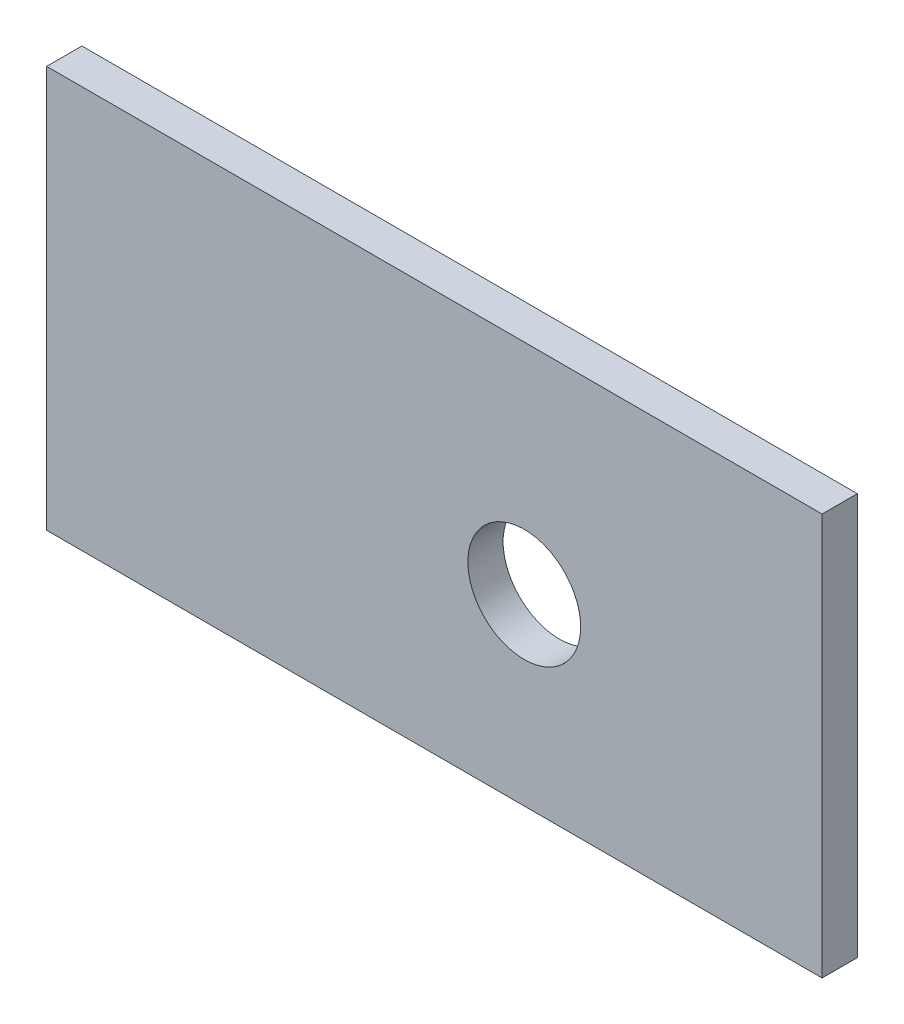
ISO-10303-21;
HEADER;
FILE_DESCRIPTION(('STEP AP214'),'2;1');
FILE_NAME('part.step','',(''),(''),'','','');
FILE_SCHEMA(('AUTOMOTIVE_DESIGN { 1 0 10303 214 1 1 1 1 }'));
ENDSEC;
DATA;
#1=APPLICATION_CONTEXT('core data for automotive mechanical design processes');
#2=APPLICATION_PROTOCOL_DEFINITION('international standard','automotive_design',2000,#1);
#3=PRODUCT_CONTEXT('',#1,'mechanical');
#4=PRODUCT('Part','Part','',(#3));
#5=PRODUCT_RELATED_PRODUCT_CATEGORY('part','',(#4));
#6=PRODUCT_DEFINITION_FORMATION('','',#4);
#7=PRODUCT_DEFINITION_CONTEXT('part definition',#1,'design');
#8=PRODUCT_DEFINITION('design','',#6,#7);
#9=PRODUCT_DEFINITION_SHAPE('','',#8);
#10=(LENGTH_UNIT() NAMED_UNIT(*) SI_UNIT(.MILLI.,.METRE.));
#11=(NAMED_UNIT(*) PLANE_ANGLE_UNIT() SI_UNIT($,.RADIAN.));
#12=(NAMED_UNIT(*) SI_UNIT($,.STERADIAN.) SOLID_ANGLE_UNIT());
#13=UNCERTAINTY_MEASURE_WITH_UNIT(LENGTH_MEASURE(1.E-05),#10,'distance_accuracy_value','');
#14=(GEOMETRIC_REPRESENTATION_CONTEXT(3) GLOBAL_UNCERTAINTY_ASSIGNED_CONTEXT((#13)) GLOBAL_UNIT_ASSIGNED_CONTEXT((#10,
#11,#12)) REPRESENTATION_CONTEXT('',''));
#15=CARTESIAN_POINT('',(0.,0.,0.));
#16=DIRECTION('',(0.,0.,1.));
#17=DIRECTION('',(1.,0.,0.));
#18=AXIS2_PLACEMENT_3D('',#15,#16,#17);
#19=CARTESIAN_POINT('',(0.,0.,5.));
#20=DIRECTION('',(0.,0.,-1.));
#21=DIRECTION('',(-1.,0.,0.));
#22=AXIS2_PLACEMENT_3D('',#19,#20,#21);
#23=PLANE('',#22);
#24=DIRECTION('',(0.,1.,0.));
#25=VECTOR('',#24,1.);
#26=CARTESIAN_POINT('',(55.,-28.5,5.));
#27=LINE('',#26,#25);
#28=CARTESIAN_POINT('',(55.,-28.5,5.));
#29=VERTEX_POINT('',#28);
#30=CARTESIAN_POINT('',(55.,28.5,5.));
#31=VERTEX_POINT('',#30);
#32=EDGE_CURVE('E92',#29,#31,#27,.T.);
#33=ORIENTED_EDGE('',*,*,#32,.T.);
#34=DIRECTION('',(-1.,0.,0.));
#35=VECTOR('',#34,1.);
#36=CARTESIAN_POINT('',(-55.,28.5,5.));
#37=LINE('',#36,#35);
#38=CARTESIAN_POINT('',(-55.,28.5,5.));
#39=VERTEX_POINT('',#38);
#40=EDGE_CURVE('E87',#31,#39,#37,.T.);
#41=ORIENTED_EDGE('',*,*,#40,.T.);
#42=DIRECTION('',(0.,-1.,0.));
#43=VECTOR('',#42,1.);
#44=CARTESIAN_POINT('',(-55.,-28.5,5.));
#45=LINE('',#44,#43);
#46=CARTESIAN_POINT('',(-55.,-28.5,5.));
#47=VERTEX_POINT('',#46);
#48=EDGE_CURVE('E90',#39,#47,#45,.T.);
#49=ORIENTED_EDGE('',*,*,#48,.T.);
#50=DIRECTION('',(1.,0.,0.));
#51=VECTOR('',#50,1.);
#52=CARTESIAN_POINT('',(-55.,-28.5,5.));
#53=LINE('',#52,#51);
#54=EDGE_CURVE('E57',#47,#29,#53,.T.);
#55=ORIENTED_EDGE('',*,*,#54,.T.);
#56=EDGE_LOOP('',(#33,#41,#49,#55));
#57=FACE_BOUND('',#56,.T.);
#58=CARTESIAN_POINT('',(12.75,-2.5,5.));
#59=DIRECTION('',(0.,0.,1.));
#60=DIRECTION('',(1.,0.,0.));
#61=AXIS2_PLACEMENT_3D('',#58,#59,#60);
#62=CIRCLE('',#61,8.);
#63=CARTESIAN_POINT('',(20.75,-2.5,5.));
#64=VERTEX_POINT('',#63);
#65=EDGE_CURVE('E112',#64,#64,#62,.T.);
#66=ORIENTED_EDGE('',*,*,#65,.F.);
#67=EDGE_LOOP('',(#66));
#68=FACE_BOUND('',#67,.T.);
#69=ADVANCED_FACE('F39',(#57,#68),#23,.F.);
#70=CARTESIAN_POINT('',(0.,0.,0.));
#71=DIRECTION('',(0.,0.,-1.));
#72=DIRECTION('',(-1.,0.,0.));
#73=AXIS2_PLACEMENT_3D('',#70,#71,#72);
#74=PLANE('',#73);
#75=DIRECTION('',(0.,1.,0.));
#76=VECTOR('',#75,1.);
#77=CARTESIAN_POINT('',(55.,-28.5,0.));
#78=LINE('',#77,#76);
#79=CARTESIAN_POINT('',(55.,-28.5,0.));
#80=VERTEX_POINT('',#79);
#81=CARTESIAN_POINT('',(55.,28.5,0.));
#82=VERTEX_POINT('',#81);
#83=EDGE_CURVE('E108',#80,#82,#78,.T.);
#84=ORIENTED_EDGE('',*,*,#83,.F.);
#85=DIRECTION('',(1.,0.,0.));
#86=VECTOR('',#85,1.);
#87=CARTESIAN_POINT('',(-55.,-28.5,0.));
#88=LINE('',#87,#86);
#89=CARTESIAN_POINT('',(-55.,-28.5,0.));
#90=VERTEX_POINT('',#89);
#91=EDGE_CURVE('E80',#90,#80,#88,.T.);
#92=ORIENTED_EDGE('',*,*,#91,.F.);
#93=DIRECTION('',(0.,-1.,0.));
#94=VECTOR('',#93,1.);
#95=CARTESIAN_POINT('',(-55.,-28.5,0.));
#96=LINE('',#95,#94);
#97=CARTESIAN_POINT('',(-55.,28.5,0.));
#98=VERTEX_POINT('',#97);
#99=EDGE_CURVE('E74',#98,#90,#96,.T.);
#100=ORIENTED_EDGE('',*,*,#99,.F.);
#101=DIRECTION('',(-1.,0.,0.));
#102=VECTOR('',#101,1.);
#103=CARTESIAN_POINT('',(-55.,28.5,0.));
#104=LINE('',#103,#102);
#105=EDGE_CURVE('E97',#82,#98,#104,.T.);
#106=ORIENTED_EDGE('',*,*,#105,.F.);
#107=EDGE_LOOP('',(#84,#92,#100,#106));
#108=FACE_BOUND('',#107,.T.);
#109=CARTESIAN_POINT('',(12.75,-2.5,0.));
#110=DIRECTION('',(0.,0.,1.));
#111=DIRECTION('',(1.,0.,0.));
#112=AXIS2_PLACEMENT_3D('',#109,#110,#111);
#113=CIRCLE('',#112,8.);
#114=CARTESIAN_POINT('',(20.75,-2.5,0.));
#115=VERTEX_POINT('',#114);
#116=EDGE_CURVE('E130',#115,#115,#113,.T.);
#117=ORIENTED_EDGE('',*,*,#116,.T.);
#118=EDGE_LOOP('',(#117));
#119=FACE_BOUND('',#118,.T.);
#120=ADVANCED_FACE('F125',(#108,#119),#74,.T.);
#121=CARTESIAN_POINT('',(55.,-28.5,5.));
#122=DIRECTION('',(-1.,0.,0.));
#123=DIRECTION('',(0.,0.,1.));
#124=AXIS2_PLACEMENT_3D('',#121,#122,#123);
#125=PLANE('',#124);
#126=ORIENTED_EDGE('',*,*,#83,.T.);
#127=DIRECTION('',(0.,0.,-1.));
#128=VECTOR('',#127,1.);
#129=CARTESIAN_POINT('',(55.,28.5,5.));
#130=LINE('',#129,#128);
#131=EDGE_CURVE('E11',#31,#82,#130,.T.);
#132=ORIENTED_EDGE('',*,*,#131,.F.);
#133=ORIENTED_EDGE('',*,*,#32,.F.);
#134=DIRECTION('',(0.,0.,-1.));
#135=VECTOR('',#134,1.);
#136=CARTESIAN_POINT('',(55.,-28.5,5.));
#137=LINE('',#136,#135);
#138=EDGE_CURVE('E104',#29,#80,#137,.T.);
#139=ORIENTED_EDGE('',*,*,#138,.T.);
#140=EDGE_LOOP('',(#126,#132,#133,#139));
#141=FACE_BOUND('',#140,.T.);
#142=ADVANCED_FACE('F41',(#141),#125,.F.);
#143=CARTESIAN_POINT('',(-55.,28.5,5.));
#144=DIRECTION('',(0.,-1.,0.));
#145=DIRECTION('',(0.,0.,-1.));
#146=AXIS2_PLACEMENT_3D('',#143,#144,#145);
#147=PLANE('',#146);
#148=ORIENTED_EDGE('',*,*,#105,.T.);
#149=DIRECTION('',(0.,0.,-1.));
#150=VECTOR('',#149,1.);
#151=CARTESIAN_POINT('',(-55.,28.5,5.));
#152=LINE('',#151,#150);
#153=EDGE_CURVE('E49',#39,#98,#152,.T.);
#154=ORIENTED_EDGE('',*,*,#153,.F.);
#155=ORIENTED_EDGE('',*,*,#40,.F.);
#156=ORIENTED_EDGE('',*,*,#131,.T.);
#157=EDGE_LOOP('',(#148,#154,#155,#156));
#158=FACE_BOUND('',#157,.T.);
#159=ADVANCED_FACE('F96',(#158),#147,.F.);
#160=CARTESIAN_POINT('',(-55.,-28.5,5.));
#161=DIRECTION('',(1.,0.,0.));
#162=DIRECTION('',(0.,0.,-1.));
#163=AXIS2_PLACEMENT_3D('',#160,#161,#162);
#164=PLANE('',#163);
#165=ORIENTED_EDGE('',*,*,#99,.T.);
#166=DIRECTION('',(0.,0.,-1.));
#167=VECTOR('',#166,1.);
#168=CARTESIAN_POINT('',(-55.,-28.5,5.));
#169=LINE('',#168,#167);
#170=EDGE_CURVE('E99',#47,#90,#169,.T.);
#171=ORIENTED_EDGE('',*,*,#170,.F.);
#172=ORIENTED_EDGE('',*,*,#48,.F.);
#173=ORIENTED_EDGE('',*,*,#153,.T.);
#174=EDGE_LOOP('',(#165,#171,#172,#173));
#175=FACE_BOUND('',#174,.T.);
#176=ADVANCED_FACE('F100',(#175),#164,.F.);
#177=CARTESIAN_POINT('',(-55.,-28.5,5.));
#178=DIRECTION('',(0.,1.,0.));
#179=DIRECTION('',(0.,0.,1.));
#180=AXIS2_PLACEMENT_3D('',#177,#178,#179);
#181=PLANE('',#180);
#182=ORIENTED_EDGE('',*,*,#91,.T.);
#183=ORIENTED_EDGE('',*,*,#138,.F.);
#184=ORIENTED_EDGE('',*,*,#54,.F.);
#185=ORIENTED_EDGE('',*,*,#170,.T.);
#186=EDGE_LOOP('',(#182,#183,#184,#185));
#187=FACE_BOUND('',#186,.T.);
#188=ADVANCED_FACE('F122',(#187),#181,.F.);
#189=CARTESIAN_POINT('',(12.75,-2.5,5.));
#190=DIRECTION('',(0.,0.,-1.));
#191=DIRECTION('',(-1.,0.,0.));
#192=AXIS2_PLACEMENT_3D('',#189,#190,#191);
#193=CYLINDRICAL_SURFACE('',#192,8.);
#194=ORIENTED_EDGE('',*,*,#65,.T.);
#195=EDGE_LOOP('',(#194));
#196=FACE_BOUND('',#195,.T.);
#197=ORIENTED_EDGE('',*,*,#116,.F.);
#198=EDGE_LOOP('',(#197));
#199=FACE_BOUND('',#198,.T.);
#200=ADVANCED_FACE('F138',(#196,#199),#193,.F.);
#201=CLOSED_SHELL('',(#69,#120,#142,#159,#176,#188,#200));
#202=MANIFOLD_SOLID_BREP('B2',#201);
#203=ADVANCED_BREP_SHAPE_REPRESENTATION('',(#18,#202),#14);
#204=SHAPE_DEFINITION_REPRESENTATION(#9,#203);
ENDSEC;
END-ISO-10303-21;
